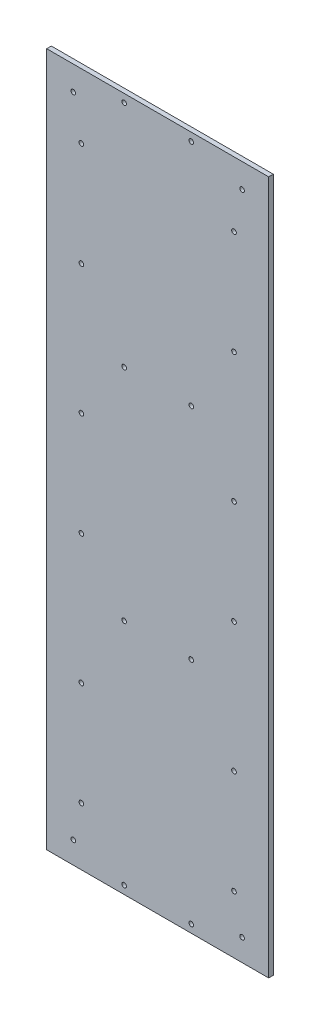
ISO-10303-21;
HEADER;
FILE_DESCRIPTION(('STEP AP214'),'2;1');
FILE_NAME('part.step','',(''),(''),'','','');
FILE_SCHEMA(('AUTOMOTIVE_DESIGN { 1 0 10303 214 1 1 1 1 }'));
ENDSEC;
DATA;
#1=APPLICATION_CONTEXT('core data for automotive mechanical design processes');
#2=APPLICATION_PROTOCOL_DEFINITION('international standard','automotive_design',2000,#1);
#3=PRODUCT_CONTEXT('',#1,'mechanical');
#4=PRODUCT('Part','Part','',(#3));
#5=PRODUCT_RELATED_PRODUCT_CATEGORY('part','',(#4));
#6=PRODUCT_DEFINITION_FORMATION('','',#4);
#7=PRODUCT_DEFINITION_CONTEXT('part definition',#1,'design');
#8=PRODUCT_DEFINITION('design','',#6,#7);
#9=PRODUCT_DEFINITION_SHAPE('','',#8);
#10=(LENGTH_UNIT() NAMED_UNIT(*) SI_UNIT(.MILLI.,.METRE.));
#11=(NAMED_UNIT(*) PLANE_ANGLE_UNIT() SI_UNIT($,.RADIAN.));
#12=(NAMED_UNIT(*) SI_UNIT($,.STERADIAN.) SOLID_ANGLE_UNIT());
#13=UNCERTAINTY_MEASURE_WITH_UNIT(LENGTH_MEASURE(1.E-05),#10,'distance_accuracy_value','');
#14=(GEOMETRIC_REPRESENTATION_CONTEXT(3) GLOBAL_UNCERTAINTY_ASSIGNED_CONTEXT((#13)) GLOBAL_UNIT_ASSIGNED_CONTEXT((#10,
#11,#12)) REPRESENTATION_CONTEXT('',''));
#15=CARTESIAN_POINT('',(0.,0.,0.));
#16=DIRECTION('',(0.,0.,1.));
#17=DIRECTION('',(1.,0.,0.));
#18=AXIS2_PLACEMENT_3D('',#15,#16,#17);
#19=CARTESIAN_POINT('',(-48.,-150.,2.));
#20=DIRECTION('',(1.,0.,0.));
#21=DIRECTION('',(0.,0.,-1.));
#22=AXIS2_PLACEMENT_3D('',#19,#20,#21);
#23=PLANE('',#22);
#24=DIRECTION('',(0.,-1.,0.));
#25=VECTOR('',#24,1.);
#26=CARTESIAN_POINT('',(-48.,-150.,0.));
#27=LINE('',#26,#25);
#28=CARTESIAN_POINT('',(-48.,150.,0.));
#29=VERTEX_POINT('',#28);
#30=CARTESIAN_POINT('',(-48.,-150.,0.));
#31=VERTEX_POINT('',#30);
#32=EDGE_CURVE('E100',#29,#31,#27,.T.);
#33=ORIENTED_EDGE('',*,*,#32,.T.);
#34=DIRECTION('',(0.,0.,-1.));
#35=VECTOR('',#34,1.);
#36=CARTESIAN_POINT('',(-48.,-150.,2.));
#37=LINE('',#36,#35);
#38=CARTESIAN_POINT('',(-48.,-150.,2.));
#39=VERTEX_POINT('',#38);
#40=EDGE_CURVE('E11',#39,#31,#37,.T.);
#41=ORIENTED_EDGE('',*,*,#40,.F.);
#42=DIRECTION('',(0.,-1.,0.));
#43=VECTOR('',#42,1.);
#44=CARTESIAN_POINT('',(-48.,-150.,2.));
#45=LINE('',#44,#43);
#46=CARTESIAN_POINT('',(-48.,150.,2.));
#47=VERTEX_POINT('',#46);
#48=EDGE_CURVE('E87',#47,#39,#45,.T.);
#49=ORIENTED_EDGE('',*,*,#48,.F.);
#50=DIRECTION('',(0.,0.,-1.));
#51=VECTOR('',#50,1.);
#52=CARTESIAN_POINT('',(-48.,150.,2.));
#53=LINE('',#52,#51);
#54=EDGE_CURVE('E96',#47,#29,#53,.T.);
#55=ORIENTED_EDGE('',*,*,#54,.T.);
#56=EDGE_LOOP('',(#33,#41,#49,#55));
#57=FACE_BOUND('',#56,.T.);
#58=ADVANCED_FACE('F34',(#57),#23,.F.);
#59=CARTESIAN_POINT('',(48.,-150.,2.));
#60=DIRECTION('',(0.,1.,0.));
#61=DIRECTION('',(0.,0.,1.));
#62=AXIS2_PLACEMENT_3D('',#59,#60,#61);
#63=PLANE('',#62);
#64=DIRECTION('',(1.,0.,0.));
#65=VECTOR('',#64,1.);
#66=CARTESIAN_POINT('',(48.,-150.,0.));
#67=LINE('',#66,#65);
#68=CARTESIAN_POINT('',(48.,-150.,0.));
#69=VERTEX_POINT('',#68);
#70=EDGE_CURVE('E91',#31,#69,#67,.T.);
#71=ORIENTED_EDGE('',*,*,#70,.T.);
#72=DIRECTION('',(0.,0.,-1.));
#73=VECTOR('',#72,1.);
#74=CARTESIAN_POINT('',(48.,-150.,2.));
#75=LINE('',#74,#73);
#76=CARTESIAN_POINT('',(48.,-150.,2.));
#77=VERTEX_POINT('',#76);
#78=EDGE_CURVE('E43',#77,#69,#75,.T.);
#79=ORIENTED_EDGE('',*,*,#78,.F.);
#80=DIRECTION('',(1.,0.,0.));
#81=VECTOR('',#80,1.);
#82=CARTESIAN_POINT('',(48.,-150.,2.));
#83=LINE('',#82,#81);
#84=EDGE_CURVE('E82',#39,#77,#83,.T.);
#85=ORIENTED_EDGE('',*,*,#84,.F.);
#86=ORIENTED_EDGE('',*,*,#40,.T.);
#87=EDGE_LOOP('',(#71,#79,#85,#86));
#88=FACE_BOUND('',#87,.T.);
#89=ADVANCED_FACE('F90',(#88),#63,.F.);
#90=CARTESIAN_POINT('',(48.,-150.,2.));
#91=DIRECTION('',(-1.,0.,0.));
#92=DIRECTION('',(0.,0.,1.));
#93=AXIS2_PLACEMENT_3D('',#90,#91,#92);
#94=PLANE('',#93);
#95=DIRECTION('',(0.,1.,0.));
#96=VECTOR('',#95,1.);
#97=CARTESIAN_POINT('',(48.,-150.,0.));
#98=LINE('',#97,#96);
#99=CARTESIAN_POINT('',(48.,150.,0.));
#100=VERTEX_POINT('',#99);
#101=EDGE_CURVE('E69',#69,#100,#98,.T.);
#102=ORIENTED_EDGE('',*,*,#101,.T.);
#103=DIRECTION('',(0.,0.,-1.));
#104=VECTOR('',#103,1.);
#105=CARTESIAN_POINT('',(48.,150.,2.));
#106=LINE('',#105,#104);
#107=CARTESIAN_POINT('',(48.,150.,2.));
#108=VERTEX_POINT('',#107);
#109=EDGE_CURVE('E92',#108,#100,#106,.T.);
#110=ORIENTED_EDGE('',*,*,#109,.F.);
#111=DIRECTION('',(0.,1.,0.));
#112=VECTOR('',#111,1.);
#113=CARTESIAN_POINT('',(48.,-150.,2.));
#114=LINE('',#113,#112);
#115=EDGE_CURVE('E85',#77,#108,#114,.T.);
#116=ORIENTED_EDGE('',*,*,#115,.F.);
#117=ORIENTED_EDGE('',*,*,#78,.T.);
#118=EDGE_LOOP('',(#102,#110,#116,#117));
#119=FACE_BOUND('',#118,.T.);
#120=ADVANCED_FACE('F94',(#119),#94,.F.);
#121=CARTESIAN_POINT('',(48.,150.,2.));
#122=DIRECTION('',(0.,-1.,0.));
#123=DIRECTION('',(1.,0.,0.));
#124=AXIS2_PLACEMENT_3D('',#121,#122,#123);
#125=PLANE('',#124);
#126=DIRECTION('',(-1.,0.,0.));
#127=VECTOR('',#126,1.);
#128=CARTESIAN_POINT('',(48.,150.,0.));
#129=LINE('',#128,#127);
#130=EDGE_CURVE('E75',#100,#29,#129,.T.);
#131=ORIENTED_EDGE('',*,*,#130,.T.);
#132=ORIENTED_EDGE('',*,*,#54,.F.);
#133=DIRECTION('',(-1.,0.,0.));
#134=VECTOR('',#133,1.);
#135=CARTESIAN_POINT('',(48.,150.,2.));
#136=LINE('',#135,#134);
#137=EDGE_CURVE('E52',#108,#47,#136,.T.);
#138=ORIENTED_EDGE('',*,*,#137,.F.);
#139=ORIENTED_EDGE('',*,*,#109,.T.);
#140=EDGE_LOOP('',(#131,#132,#138,#139));
#141=FACE_BOUND('',#140,.T.);
#142=ADVANCED_FACE('F249',(#141),#125,.F.);
#143=CARTESIAN_POINT('',(0.,0.,2.));
#144=DIRECTION('',(0.,0.,1.));
#145=DIRECTION('',(1.,0.,0.));
#146=AXIS2_PLACEMENT_3D('',#143,#144,#145);
#147=PLANE('',#146);
#148=CARTESIAN_POINT('',(36.5,139.5,2.));
#149=DIRECTION('',(0.,0.,1.));
#150=DIRECTION('',(1.,0.,0.));
#151=AXIS2_PLACEMENT_3D('',#148,#149,#150);
#152=CIRCLE('',#151,0.999999999999998);
#153=CARTESIAN_POINT('',(37.5,139.5,2.));
#154=VERTEX_POINT('',#153);
#155=EDGE_CURVE('E530',#154,#154,#152,.T.);
#156=ORIENTED_EDGE('',*,*,#155,.F.);
#157=EDGE_LOOP('',(#156));
#158=FACE_BOUND('',#157,.T.);
#159=CARTESIAN_POINT('',(-36.5,-140.5,2.));
#160=DIRECTION('',(0.,0.,1.));
#161=DIRECTION('',(1.,0.,0.));
#162=AXIS2_PLACEMENT_3D('',#159,#160,#161);
#163=CIRCLE('',#162,0.999999999999998);
#164=CARTESIAN_POINT('',(-35.5,-140.5,2.));
#165=VERTEX_POINT('',#164);
#166=EDGE_CURVE('E531',#165,#165,#163,.T.);
#167=ORIENTED_EDGE('',*,*,#166,.F.);
#168=EDGE_LOOP('',(#167));
#169=FACE_BOUND('',#168,.T.);
#170=CARTESIAN_POINT('',(36.5,-140.5,2.));
#171=DIRECTION('',(0.,0.,1.));
#172=DIRECTION('',(1.,0.,0.));
#173=AXIS2_PLACEMENT_3D('',#170,#171,#172);
#174=CIRCLE('',#173,0.999999999999998);
#175=CARTESIAN_POINT('',(37.5,-140.5,2.));
#176=VERTEX_POINT('',#175);
#177=EDGE_CURVE('E536',#176,#176,#174,.T.);
#178=ORIENTED_EDGE('',*,*,#177,.F.);
#179=EDGE_LOOP('',(#178));
#180=FACE_BOUND('',#179,.T.);
#181=CARTESIAN_POINT('',(-36.5,139.5,2.));
#182=DIRECTION('',(0.,0.,1.));
#183=DIRECTION('',(1.,0.,0.));
#184=AXIS2_PLACEMENT_3D('',#181,#182,#183);
#185=CIRCLE('',#184,0.999999999999998);
#186=CARTESIAN_POINT('',(-35.5,139.5,2.));
#187=VERTEX_POINT('',#186);
#188=EDGE_CURVE('E173',#187,#187,#185,.T.);
#189=ORIENTED_EDGE('',*,*,#188,.F.);
#190=EDGE_LOOP('',(#189));
#191=FACE_BOUND('',#190,.T.);
#192=CARTESIAN_POINT('',(14.5,-146.5,2.));
#193=DIRECTION('',(0.,0.,1.));
#194=DIRECTION('',(1.,0.,0.));
#195=AXIS2_PLACEMENT_3D('',#192,#193,#194);
#196=CIRCLE('',#195,1.);
#197=CARTESIAN_POINT('',(15.5,-146.5,2.));
#198=VERTEX_POINT('',#197);
#199=EDGE_CURVE('E203',#198,#198,#196,.T.);
#200=ORIENTED_EDGE('',*,*,#199,.F.);
#201=EDGE_LOOP('',(#200));
#202=FACE_BOUND('',#201,.T.);
#203=CARTESIAN_POINT('',(33.,122.,2.));
#204=DIRECTION('',(0.,0.,1.));
#205=DIRECTION('',(-1.,0.,0.));
#206=AXIS2_PLACEMENT_3D('',#203,#204,#205);
#207=CIRCLE('',#206,0.999999999999998);
#208=CARTESIAN_POINT('',(32.,122.,2.));
#209=VERTEX_POINT('',#208);
#210=EDGE_CURVE('E206',#209,#209,#207,.T.);
#211=ORIENTED_EDGE('',*,*,#210,.F.);
#212=EDGE_LOOP('',(#211));
#213=FACE_BOUND('',#212,.T.);
#214=CARTESIAN_POINT('',(33.,77.,2.));
#215=DIRECTION('',(0.,0.,1.));
#216=DIRECTION('',(-1.,0.,0.));
#217=AXIS2_PLACEMENT_3D('',#214,#215,#216);
#218=CIRCLE('',#217,0.999999999999998);
#219=CARTESIAN_POINT('',(32.,77.,2.));
#220=VERTEX_POINT('',#219);
#221=EDGE_CURVE('E209',#220,#220,#218,.T.);
#222=ORIENTED_EDGE('',*,*,#221,.F.);
#223=EDGE_LOOP('',(#222));
#224=FACE_BOUND('',#223,.T.);
#225=CARTESIAN_POINT('',(33.,-125.,2.));
#226=DIRECTION('',(0.,0.,1.));
#227=DIRECTION('',(-1.,0.,0.));
#228=AXIS2_PLACEMENT_3D('',#225,#226,#227);
#229=CIRCLE('',#228,0.999999999999998);
#230=CARTESIAN_POINT('',(32.,-125.,2.));
#231=VERTEX_POINT('',#230);
#232=EDGE_CURVE('E212',#231,#231,#229,.T.);
#233=ORIENTED_EDGE('',*,*,#232,.F.);
#234=EDGE_LOOP('',(#233));
#235=FACE_BOUND('',#234,.T.);
#236=CARTESIAN_POINT('',(-14.5000000000007,47.5,2.));
#237=DIRECTION('',(0.,0.,1.));
#238=DIRECTION('',(-1.,0.,0.));
#239=AXIS2_PLACEMENT_3D('',#236,#237,#238);
#240=CIRCLE('',#239,1.);
#241=CARTESIAN_POINT('',(-15.5000000000007,47.5,2.));
#242=VERTEX_POINT('',#241);
#243=EDGE_CURVE('E197',#242,#242,#240,.T.);
#244=ORIENTED_EDGE('',*,*,#243,.F.);
#245=EDGE_LOOP('',(#244));
#246=FACE_BOUND('',#245,.T.);
#247=CARTESIAN_POINT('',(14.5,-47.5,2.));
#248=DIRECTION('',(0.,0.,1.));
#249=DIRECTION('',(1.,0.,0.));
#250=AXIS2_PLACEMENT_3D('',#247,#248,#249);
#251=CIRCLE('',#250,1.);
#252=CARTESIAN_POINT('',(15.5,-47.5,2.));
#253=VERTEX_POINT('',#252);
#254=EDGE_CURVE('E193',#253,#253,#251,.T.);
#255=ORIENTED_EDGE('',*,*,#254,.F.);
#256=EDGE_LOOP('',(#255));
#257=FACE_BOUND('',#256,.T.);
#258=CARTESIAN_POINT('',(-14.5,-47.5,2.));
#259=DIRECTION('',(0.,0.,1.));
#260=DIRECTION('',(-1.,0.,0.));
#261=AXIS2_PLACEMENT_3D('',#258,#259,#260);
#262=CIRCLE('',#261,1.);
#263=CARTESIAN_POINT('',(-15.5,-47.5,2.));
#264=VERTEX_POINT('',#263);
#265=EDGE_CURVE('E196',#264,#264,#262,.T.);
#266=ORIENTED_EDGE('',*,*,#265,.F.);
#267=EDGE_LOOP('',(#266));
#268=FACE_BOUND('',#267,.T.);
#269=CARTESIAN_POINT('',(-14.5,-146.5,2.));
#270=DIRECTION('',(0.,0.,1.));
#271=DIRECTION('',(-1.,0.,0.));
#272=AXIS2_PLACEMENT_3D('',#269,#270,#271);
#273=CIRCLE('',#272,1.);
#274=CARTESIAN_POINT('',(-15.5,-146.5,2.));
#275=VERTEX_POINT('',#274);
#276=EDGE_CURVE('E200',#275,#275,#273,.T.);
#277=ORIENTED_EDGE('',*,*,#276,.F.);
#278=EDGE_LOOP('',(#277));
#279=FACE_BOUND('',#278,.T.);
#280=CARTESIAN_POINT('',(-33.,21.,2.));
#281=DIRECTION('',(0.,0.,1.));
#282=DIRECTION('',(1.,0.,0.));
#283=AXIS2_PLACEMENT_3D('',#280,#281,#282);
#284=CIRCLE('',#283,0.999999999999998);
#285=CARTESIAN_POINT('',(-32.,21.,2.));
#286=VERTEX_POINT('',#285);
#287=EDGE_CURVE('E221',#286,#286,#284,.T.);
#288=ORIENTED_EDGE('',*,*,#287,.F.);
#289=EDGE_LOOP('',(#288));
#290=FACE_BOUND('',#289,.T.);
#291=CARTESIAN_POINT('',(-33.,-24.,2.));
#292=DIRECTION('',(0.,0.,1.));
#293=DIRECTION('',(1.,0.,0.));
#294=AXIS2_PLACEMENT_3D('',#291,#292,#293);
#295=CIRCLE('',#294,0.999999999999998);
#296=CARTESIAN_POINT('',(-32.,-24.,2.));
#297=VERTEX_POINT('',#296);
#298=EDGE_CURVE('E230',#297,#297,#295,.T.);
#299=ORIENTED_EDGE('',*,*,#298,.F.);
#300=EDGE_LOOP('',(#299));
#301=FACE_BOUND('',#300,.T.);
#302=CARTESIAN_POINT('',(-33.,-80.,2.));
#303=DIRECTION('',(0.,0.,1.));
#304=DIRECTION('',(1.,0.,0.));
#305=AXIS2_PLACEMENT_3D('',#302,#303,#304);
#306=CIRCLE('',#305,0.999999999999998);
#307=CARTESIAN_POINT('',(-32.,-80.,2.));
#308=VERTEX_POINT('',#307);
#309=EDGE_CURVE('E233',#308,#308,#306,.T.);
#310=ORIENTED_EDGE('',*,*,#309,.F.);
#311=EDGE_LOOP('',(#310));
#312=FACE_BOUND('',#311,.T.);
#313=CARTESIAN_POINT('',(-33.,77.,2.));
#314=DIRECTION('',(0.,0.,1.));
#315=DIRECTION('',(1.,0.,0.));
#316=AXIS2_PLACEMENT_3D('',#313,#314,#315);
#317=CIRCLE('',#316,0.999999999999998);
#318=CARTESIAN_POINT('',(-32.,77.,2.));
#319=VERTEX_POINT('',#318);
#320=EDGE_CURVE('E236',#319,#319,#317,.T.);
#321=ORIENTED_EDGE('',*,*,#320,.F.);
#322=EDGE_LOOP('',(#321));
#323=FACE_BOUND('',#322,.T.);
#324=CARTESIAN_POINT('',(33.,21.,2.));
#325=DIRECTION('',(0.,0.,1.));
#326=DIRECTION('',(-1.,0.,0.));
#327=AXIS2_PLACEMENT_3D('',#324,#325,#326);
#328=CIRCLE('',#327,0.999999999999998);
#329=CARTESIAN_POINT('',(32.,21.,2.));
#330=VERTEX_POINT('',#329);
#331=EDGE_CURVE('E218',#330,#330,#328,.T.);
#332=ORIENTED_EDGE('',*,*,#331,.F.);
#333=EDGE_LOOP('',(#332));
#334=FACE_BOUND('',#333,.T.);
#335=CARTESIAN_POINT('',(33.,-24.,2.));
#336=DIRECTION('',(0.,0.,1.));
#337=DIRECTION('',(-1.,0.,0.));
#338=AXIS2_PLACEMENT_3D('',#335,#336,#337);
#339=CIRCLE('',#338,0.999999999999998);
#340=CARTESIAN_POINT('',(32.,-24.,2.));
#341=VERTEX_POINT('',#340);
#342=EDGE_CURVE('E222',#341,#341,#339,.T.);
#343=ORIENTED_EDGE('',*,*,#342,.F.);
#344=EDGE_LOOP('',(#343));
#345=FACE_BOUND('',#344,.T.);
#346=CARTESIAN_POINT('',(33.,-80.,2.));
#347=DIRECTION('',(0.,0.,1.));
#348=DIRECTION('',(-1.,0.,0.));
#349=AXIS2_PLACEMENT_3D('',#346,#347,#348);
#350=CIRCLE('',#349,0.999999999999998);
#351=CARTESIAN_POINT('',(32.,-80.,2.));
#352=VERTEX_POINT('',#351);
#353=EDGE_CURVE('E225',#352,#352,#350,.T.);
#354=ORIENTED_EDGE('',*,*,#353,.F.);
#355=EDGE_LOOP('',(#354));
#356=FACE_BOUND('',#355,.T.);
#357=CARTESIAN_POINT('',(-33.,-125.,2.));
#358=DIRECTION('',(0.,0.,1.));
#359=DIRECTION('',(1.,0.,0.));
#360=AXIS2_PLACEMENT_3D('',#357,#358,#359);
#361=CIRCLE('',#360,0.999999999999998);
#362=CARTESIAN_POINT('',(-32.,-125.,2.));
#363=VERTEX_POINT('',#362);
#364=EDGE_CURVE('E215',#363,#363,#361,.T.);
#365=ORIENTED_EDGE('',*,*,#364,.F.);
#366=EDGE_LOOP('',(#365));
#367=FACE_BOUND('',#366,.T.);
#368=CARTESIAN_POINT('',(14.499999999999,146.5,2.));
#369=DIRECTION('',(0.,0.,1.));
#370=DIRECTION('',(1.,0.,0.));
#371=AXIS2_PLACEMENT_3D('',#368,#369,#370);
#372=CIRCLE('',#371,1.);
#373=CARTESIAN_POINT('',(15.499999999999,146.5,2.));
#374=VERTEX_POINT('',#373);
#375=EDGE_CURVE('E189',#374,#374,#372,.T.);
#376=ORIENTED_EDGE('',*,*,#375,.F.);
#377=EDGE_LOOP('',(#376));
#378=FACE_BOUND('',#377,.T.);
#379=CARTESIAN_POINT('',(-14.500000000001,146.5,2.));
#380=DIRECTION('',(0.,0.,1.));
#381=DIRECTION('',(-1.,0.,0.));
#382=AXIS2_PLACEMENT_3D('',#379,#380,#381);
#383=CIRCLE('',#382,1.);
#384=CARTESIAN_POINT('',(-15.500000000001,146.5,2.));
#385=VERTEX_POINT('',#384);
#386=EDGE_CURVE('E184',#385,#385,#383,.T.);
#387=ORIENTED_EDGE('',*,*,#386,.F.);
#388=EDGE_LOOP('',(#387));
#389=FACE_BOUND('',#388,.T.);
#390=CARTESIAN_POINT('',(14.5000000000007,47.5,2.));
#391=DIRECTION('',(0.,0.,1.));
#392=DIRECTION('',(1.,0.,0.));
#393=AXIS2_PLACEMENT_3D('',#390,#391,#392);
#394=CIRCLE('',#393,1.);
#395=CARTESIAN_POINT('',(15.5000000000007,47.5,2.));
#396=VERTEX_POINT('',#395);
#397=EDGE_CURVE('E180',#396,#396,#394,.T.);
#398=ORIENTED_EDGE('',*,*,#397,.F.);
#399=EDGE_LOOP('',(#398));
#400=FACE_BOUND('',#399,.T.);
#401=CARTESIAN_POINT('',(-33.,122.,2.));
#402=DIRECTION('',(0.,0.,1.));
#403=DIRECTION('',(1.,0.,0.));
#404=AXIS2_PLACEMENT_3D('',#401,#402,#403);
#405=CIRCLE('',#404,0.999999999999998);
#406=CARTESIAN_POINT('',(-32.,122.,2.));
#407=VERTEX_POINT('',#406);
#408=EDGE_CURVE('E113',#407,#407,#405,.T.);
#409=ORIENTED_EDGE('',*,*,#408,.F.);
#410=EDGE_LOOP('',(#409));
#411=FACE_BOUND('',#410,.T.);
#412=ORIENTED_EDGE('',*,*,#48,.T.);
#413=ORIENTED_EDGE('',*,*,#84,.T.);
#414=ORIENTED_EDGE('',*,*,#115,.T.);
#415=ORIENTED_EDGE('',*,*,#137,.T.);
#416=EDGE_LOOP('',(#412,#413,#414,#415));
#417=FACE_BOUND('',#416,.T.);
#418=ADVANCED_FACE('F83',(#158,#169,#180,#191,#202,#213,#224,#235,#246,#257,#268,#279,#290,#301,
#312,#323,#334,#345,#356,#367,#378,#389,#400,#411,#417),#147,.T.);
#419=CARTESIAN_POINT('',(0.,0.,0.));
#420=DIRECTION('',(0.,0.,1.));
#421=DIRECTION('',(1.,0.,0.));
#422=AXIS2_PLACEMENT_3D('',#419,#420,#421);
#423=PLANE('',#422);
#424=CARTESIAN_POINT('',(36.5,139.5,0.));
#425=DIRECTION('',(0.,0.,1.));
#426=DIRECTION('',(1.,0.,0.));
#427=AXIS2_PLACEMENT_3D('',#424,#425,#426);
#428=CIRCLE('',#427,0.999999999999998);
#429=CARTESIAN_POINT('',(37.5,139.5,0.));
#430=VERTEX_POINT('',#429);
#431=EDGE_CURVE('E37',#430,#430,#428,.T.);
#432=ORIENTED_EDGE('',*,*,#431,.T.);
#433=EDGE_LOOP('',(#432));
#434=FACE_BOUND('',#433,.T.);
#435=CARTESIAN_POINT('',(-36.5,-140.5,0.));
#436=DIRECTION('',(0.,0.,1.));
#437=DIRECTION('',(1.,0.,0.));
#438=AXIS2_PLACEMENT_3D('',#435,#436,#437);
#439=CIRCLE('',#438,0.999999999999998);
#440=CARTESIAN_POINT('',(-35.5,-140.5,0.));
#441=VERTEX_POINT('',#440);
#442=EDGE_CURVE('E175',#441,#441,#439,.T.);
#443=ORIENTED_EDGE('',*,*,#442,.T.);
#444=EDGE_LOOP('',(#443));
#445=FACE_BOUND('',#444,.T.);
#446=CARTESIAN_POINT('',(36.5,-140.5,0.));
#447=DIRECTION('',(0.,0.,1.));
#448=DIRECTION('',(1.,0.,0.));
#449=AXIS2_PLACEMENT_3D('',#446,#447,#448);
#450=CIRCLE('',#449,0.999999999999998);
#451=CARTESIAN_POINT('',(37.5,-140.5,0.));
#452=VERTEX_POINT('',#451);
#453=EDGE_CURVE('E172',#452,#452,#450,.T.);
#454=ORIENTED_EDGE('',*,*,#453,.T.);
#455=EDGE_LOOP('',(#454));
#456=FACE_BOUND('',#455,.T.);
#457=CARTESIAN_POINT('',(-36.5,139.5,0.));
#458=DIRECTION('',(0.,0.,1.));
#459=DIRECTION('',(1.,0.,0.));
#460=AXIS2_PLACEMENT_3D('',#457,#458,#459);
#461=CIRCLE('',#460,0.999999999999998);
#462=CARTESIAN_POINT('',(-35.5,139.5,0.));
#463=VERTEX_POINT('',#462);
#464=EDGE_CURVE('E169',#463,#463,#461,.T.);
#465=ORIENTED_EDGE('',*,*,#464,.T.);
#466=EDGE_LOOP('',(#465));
#467=FACE_BOUND('',#466,.T.);
#468=CARTESIAN_POINT('',(14.5,-146.5,0.));
#469=DIRECTION('',(0.,0.,1.));
#470=DIRECTION('',(1.,0.,0.));
#471=AXIS2_PLACEMENT_3D('',#468,#469,#470);
#472=CIRCLE('',#471,1.);
#473=CARTESIAN_POINT('',(15.5,-146.5,0.));
#474=VERTEX_POINT('',#473);
#475=EDGE_CURVE('E103',#474,#474,#472,.T.);
#476=ORIENTED_EDGE('',*,*,#475,.T.);
#477=EDGE_LOOP('',(#476));
#478=FACE_BOUND('',#477,.T.);
#479=CARTESIAN_POINT('',(33.,122.,0.));
#480=DIRECTION('',(0.,0.,1.));
#481=DIRECTION('',(1.,0.,0.));
#482=AXIS2_PLACEMENT_3D('',#479,#480,#481);
#483=CIRCLE('',#482,0.999999999999998);
#484=CARTESIAN_POINT('',(34.,122.,0.));
#485=VERTEX_POINT('',#484);
#486=EDGE_CURVE('E164',#485,#485,#483,.T.);
#487=ORIENTED_EDGE('',*,*,#486,.T.);
#488=EDGE_LOOP('',(#487));
#489=FACE_BOUND('',#488,.T.);
#490=CARTESIAN_POINT('',(33.,77.,0.));
#491=DIRECTION('',(0.,0.,1.));
#492=DIRECTION('',(1.,0.,0.));
#493=AXIS2_PLACEMENT_3D('',#490,#491,#492);
#494=CIRCLE('',#493,0.999999999999998);
#495=CARTESIAN_POINT('',(34.,77.,0.));
#496=VERTEX_POINT('',#495);
#497=EDGE_CURVE('E161',#496,#496,#494,.T.);
#498=ORIENTED_EDGE('',*,*,#497,.T.);
#499=EDGE_LOOP('',(#498));
#500=FACE_BOUND('',#499,.T.);
#501=CARTESIAN_POINT('',(33.,-125.,0.));
#502=DIRECTION('',(0.,0.,1.));
#503=DIRECTION('',(1.,0.,0.));
#504=AXIS2_PLACEMENT_3D('',#501,#502,#503);
#505=CIRCLE('',#504,0.999999999999998);
#506=CARTESIAN_POINT('',(34.,-125.,0.));
#507=VERTEX_POINT('',#506);
#508=EDGE_CURVE('E158',#507,#507,#505,.T.);
#509=ORIENTED_EDGE('',*,*,#508,.T.);
#510=EDGE_LOOP('',(#509));
#511=FACE_BOUND('',#510,.T.);
#512=CARTESIAN_POINT('',(-14.5000000000007,47.5,0.));
#513=DIRECTION('',(0.,0.,1.));
#514=DIRECTION('',(1.,0.,0.));
#515=AXIS2_PLACEMENT_3D('',#512,#513,#514);
#516=CIRCLE('',#515,1.);
#517=CARTESIAN_POINT('',(-13.5000000000007,47.5,0.));
#518=VERTEX_POINT('',#517);
#519=EDGE_CURVE('E155',#518,#518,#516,.T.);
#520=ORIENTED_EDGE('',*,*,#519,.T.);
#521=EDGE_LOOP('',(#520));
#522=FACE_BOUND('',#521,.T.);
#523=CARTESIAN_POINT('',(14.5,-47.5,0.));
#524=DIRECTION('',(0.,0.,1.));
#525=DIRECTION('',(1.,0.,0.));
#526=AXIS2_PLACEMENT_3D('',#523,#524,#525);
#527=CIRCLE('',#526,1.);
#528=CARTESIAN_POINT('',(15.5,-47.5,0.));
#529=VERTEX_POINT('',#528);
#530=EDGE_CURVE('E152',#529,#529,#527,.T.);
#531=ORIENTED_EDGE('',*,*,#530,.T.);
#532=EDGE_LOOP('',(#531));
#533=FACE_BOUND('',#532,.T.);
#534=CARTESIAN_POINT('',(-14.5,-47.5,0.));
#535=DIRECTION('',(0.,0.,1.));
#536=DIRECTION('',(1.,0.,0.));
#537=AXIS2_PLACEMENT_3D('',#534,#535,#536);
#538=CIRCLE('',#537,1.);
#539=CARTESIAN_POINT('',(-13.5,-47.5,0.));
#540=VERTEX_POINT('',#539);
#541=EDGE_CURVE('E149',#540,#540,#538,.T.);
#542=ORIENTED_EDGE('',*,*,#541,.T.);
#543=EDGE_LOOP('',(#542));
#544=FACE_BOUND('',#543,.T.);
#545=CARTESIAN_POINT('',(-14.5,-146.5,0.));
#546=DIRECTION('',(0.,0.,1.));
#547=DIRECTION('',(1.,0.,0.));
#548=AXIS2_PLACEMENT_3D('',#545,#546,#547);
#549=CIRCLE('',#548,1.);
#550=CARTESIAN_POINT('',(-13.5,-146.5,0.));
#551=VERTEX_POINT('',#550);
#552=EDGE_CURVE('E146',#551,#551,#549,.T.);
#553=ORIENTED_EDGE('',*,*,#552,.T.);
#554=EDGE_LOOP('',(#553));
#555=FACE_BOUND('',#554,.T.);
#556=CARTESIAN_POINT('',(-33.,21.,0.));
#557=DIRECTION('',(0.,0.,1.));
#558=DIRECTION('',(1.,0.,0.));
#559=AXIS2_PLACEMENT_3D('',#556,#557,#558);
#560=CIRCLE('',#559,0.999999999999998);
#561=CARTESIAN_POINT('',(-32.,21.,0.));
#562=VERTEX_POINT('',#561);
#563=EDGE_CURVE('E143',#562,#562,#560,.T.);
#564=ORIENTED_EDGE('',*,*,#563,.T.);
#565=EDGE_LOOP('',(#564));
#566=FACE_BOUND('',#565,.T.);
#567=CARTESIAN_POINT('',(-33.,-24.,0.));
#568=DIRECTION('',(0.,0.,1.));
#569=DIRECTION('',(1.,0.,0.));
#570=AXIS2_PLACEMENT_3D('',#567,#568,#569);
#571=CIRCLE('',#570,0.999999999999998);
#572=CARTESIAN_POINT('',(-32.,-24.,0.));
#573=VERTEX_POINT('',#572);
#574=EDGE_CURVE('E140',#573,#573,#571,.T.);
#575=ORIENTED_EDGE('',*,*,#574,.T.);
#576=EDGE_LOOP('',(#575));
#577=FACE_BOUND('',#576,.T.);
#578=CARTESIAN_POINT('',(-33.,-80.,0.));
#579=DIRECTION('',(0.,0.,1.));
#580=DIRECTION('',(1.,0.,0.));
#581=AXIS2_PLACEMENT_3D('',#578,#579,#580);
#582=CIRCLE('',#581,0.999999999999998);
#583=CARTESIAN_POINT('',(-32.,-80.,0.));
#584=VERTEX_POINT('',#583);
#585=EDGE_CURVE('E137',#584,#584,#582,.T.);
#586=ORIENTED_EDGE('',*,*,#585,.T.);
#587=EDGE_LOOP('',(#586));
#588=FACE_BOUND('',#587,.T.);
#589=CARTESIAN_POINT('',(-33.,77.,0.));
#590=DIRECTION('',(0.,0.,1.));
#591=DIRECTION('',(1.,0.,0.));
#592=AXIS2_PLACEMENT_3D('',#589,#590,#591);
#593=CIRCLE('',#592,0.999999999999998);
#594=CARTESIAN_POINT('',(-32.,77.,0.));
#595=VERTEX_POINT('',#594);
#596=EDGE_CURVE('E134',#595,#595,#593,.T.);
#597=ORIENTED_EDGE('',*,*,#596,.T.);
#598=EDGE_LOOP('',(#597));
#599=FACE_BOUND('',#598,.T.);
#600=CARTESIAN_POINT('',(33.,21.,0.));
#601=DIRECTION('',(0.,0.,1.));
#602=DIRECTION('',(1.,0.,0.));
#603=AXIS2_PLACEMENT_3D('',#600,#601,#602);
#604=CIRCLE('',#603,0.999999999999998);
#605=CARTESIAN_POINT('',(34.,21.,0.));
#606=VERTEX_POINT('',#605);
#607=EDGE_CURVE('E131',#606,#606,#604,.T.);
#608=ORIENTED_EDGE('',*,*,#607,.T.);
#609=EDGE_LOOP('',(#608));
#610=FACE_BOUND('',#609,.T.);
#611=CARTESIAN_POINT('',(33.,-24.,0.));
#612=DIRECTION('',(0.,0.,1.));
#613=DIRECTION('',(1.,0.,0.));
#614=AXIS2_PLACEMENT_3D('',#611,#612,#613);
#615=CIRCLE('',#614,0.999999999999998);
#616=CARTESIAN_POINT('',(34.,-24.,0.));
#617=VERTEX_POINT('',#616);
#618=EDGE_CURVE('E128',#617,#617,#615,.T.);
#619=ORIENTED_EDGE('',*,*,#618,.T.);
#620=EDGE_LOOP('',(#619));
#621=FACE_BOUND('',#620,.T.);
#622=CARTESIAN_POINT('',(33.,-80.,0.));
#623=DIRECTION('',(0.,0.,1.));
#624=DIRECTION('',(1.,0.,0.));
#625=AXIS2_PLACEMENT_3D('',#622,#623,#624);
#626=CIRCLE('',#625,0.999999999999998);
#627=CARTESIAN_POINT('',(34.,-80.,0.));
#628=VERTEX_POINT('',#627);
#629=EDGE_CURVE('E125',#628,#628,#626,.T.);
#630=ORIENTED_EDGE('',*,*,#629,.T.);
#631=EDGE_LOOP('',(#630));
#632=FACE_BOUND('',#631,.T.);
#633=CARTESIAN_POINT('',(-33.,-125.,0.));
#634=DIRECTION('',(0.,0.,1.));
#635=DIRECTION('',(1.,0.,0.));
#636=AXIS2_PLACEMENT_3D('',#633,#634,#635);
#637=CIRCLE('',#636,0.999999999999998);
#638=CARTESIAN_POINT('',(-32.,-125.,0.));
#639=VERTEX_POINT('',#638);
#640=EDGE_CURVE('E122',#639,#639,#637,.T.);
#641=ORIENTED_EDGE('',*,*,#640,.T.);
#642=EDGE_LOOP('',(#641));
#643=FACE_BOUND('',#642,.T.);
#644=CARTESIAN_POINT('',(14.499999999999,146.5,0.));
#645=DIRECTION('',(0.,0.,1.));
#646=DIRECTION('',(1.,0.,0.));
#647=AXIS2_PLACEMENT_3D('',#644,#645,#646);
#648=CIRCLE('',#647,1.);
#649=CARTESIAN_POINT('',(15.499999999999,146.5,0.));
#650=VERTEX_POINT('',#649);
#651=EDGE_CURVE('E119',#650,#650,#648,.T.);
#652=ORIENTED_EDGE('',*,*,#651,.T.);
#653=EDGE_LOOP('',(#652));
#654=FACE_BOUND('',#653,.T.);
#655=CARTESIAN_POINT('',(-14.500000000001,146.5,0.));
#656=DIRECTION('',(0.,0.,1.));
#657=DIRECTION('',(1.,0.,0.));
#658=AXIS2_PLACEMENT_3D('',#655,#656,#657);
#659=CIRCLE('',#658,1.);
#660=CARTESIAN_POINT('',(-13.500000000001,146.5,0.));
#661=VERTEX_POINT('',#660);
#662=EDGE_CURVE('E116',#661,#661,#659,.T.);
#663=ORIENTED_EDGE('',*,*,#662,.T.);
#664=EDGE_LOOP('',(#663));
#665=FACE_BOUND('',#664,.T.);
#666=CARTESIAN_POINT('',(14.5000000000007,47.5,0.));
#667=DIRECTION('',(0.,0.,1.));
#668=DIRECTION('',(1.,0.,0.));
#669=AXIS2_PLACEMENT_3D('',#666,#667,#668);
#670=CIRCLE('',#669,1.);
#671=CARTESIAN_POINT('',(15.5000000000007,47.5,0.));
#672=VERTEX_POINT('',#671);
#673=EDGE_CURVE('E112',#672,#672,#670,.T.);
#674=ORIENTED_EDGE('',*,*,#673,.T.);
#675=EDGE_LOOP('',(#674));
#676=FACE_BOUND('',#675,.T.);
#677=CARTESIAN_POINT('',(-33.,122.,0.));
#678=DIRECTION('',(0.,0.,1.));
#679=DIRECTION('',(1.,0.,0.));
#680=AXIS2_PLACEMENT_3D('',#677,#678,#679);
#681=CIRCLE('',#680,0.999999999999998);
#682=CARTESIAN_POINT('',(-32.,122.,0.));
#683=VERTEX_POINT('',#682);
#684=EDGE_CURVE('E109',#683,#683,#681,.T.);
#685=ORIENTED_EDGE('',*,*,#684,.T.);
#686=EDGE_LOOP('',(#685));
#687=FACE_BOUND('',#686,.T.);
#688=ORIENTED_EDGE('',*,*,#32,.F.);
#689=ORIENTED_EDGE('',*,*,#130,.F.);
#690=ORIENTED_EDGE('',*,*,#101,.F.);
#691=ORIENTED_EDGE('',*,*,#70,.F.);
#692=EDGE_LOOP('',(#688,#689,#690,#691));
#693=FACE_BOUND('',#692,.T.);
#694=ADVANCED_FACE('F248',(#434,#445,#456,#467,#478,#489,#500,#511,#522,#533,#544,#555,#566,
#577,#588,#599,#610,#621,#632,#643,#654,#665,#676,#687,#693),#423,.F.);
#695=CARTESIAN_POINT('',(-33.,122.,-8.));
#696=DIRECTION('',(0.,0.,1.));
#697=DIRECTION('',(1.,0.,0.));
#698=AXIS2_PLACEMENT_3D('',#695,#696,#697);
#699=CYLINDRICAL_SURFACE('',#698,0.999999999999998);
#700=ORIENTED_EDGE('',*,*,#408,.T.);
#701=EDGE_LOOP('',(#700));
#702=FACE_BOUND('',#701,.T.);
#703=ORIENTED_EDGE('',*,*,#684,.F.);
#704=EDGE_LOOP('',(#703));
#705=FACE_BOUND('',#704,.T.);
#706=ADVANCED_FACE('F244',(#702,#705),#699,.F.);
#707=CARTESIAN_POINT('',(14.5000000000007,47.5,-8.));
#708=DIRECTION('',(0.,0.,1.));
#709=DIRECTION('',(1.,0.,0.));
#710=AXIS2_PLACEMENT_3D('',#707,#708,#709);
#711=CYLINDRICAL_SURFACE('',#710,1.);
#712=ORIENTED_EDGE('',*,*,#397,.T.);
#713=EDGE_LOOP('',(#712));
#714=FACE_BOUND('',#713,.T.);
#715=ORIENTED_EDGE('',*,*,#673,.F.);
#716=EDGE_LOOP('',(#715));
#717=FACE_BOUND('',#716,.T.);
#718=ADVANCED_FACE('F288',(#714,#717),#711,.F.);
#719=CARTESIAN_POINT('',(-14.500000000001,146.5,-8.));
#720=DIRECTION('',(0.,0.,1.));
#721=DIRECTION('',(1.,0.,0.));
#722=AXIS2_PLACEMENT_3D('',#719,#720,#721);
#723=CYLINDRICAL_SURFACE('',#722,1.);
#724=ORIENTED_EDGE('',*,*,#386,.T.);
#725=EDGE_LOOP('',(#724));
#726=FACE_BOUND('',#725,.T.);
#727=ORIENTED_EDGE('',*,*,#662,.F.);
#728=EDGE_LOOP('',(#727));
#729=FACE_BOUND('',#728,.T.);
#730=ADVANCED_FACE('F297',(#726,#729),#723,.F.);
#731=CARTESIAN_POINT('',(14.499999999999,146.5,-8.));
#732=DIRECTION('',(0.,0.,1.));
#733=DIRECTION('',(1.,0.,0.));
#734=AXIS2_PLACEMENT_3D('',#731,#732,#733);
#735=CYLINDRICAL_SURFACE('',#734,1.);
#736=ORIENTED_EDGE('',*,*,#375,.T.);
#737=EDGE_LOOP('',(#736));
#738=FACE_BOUND('',#737,.T.);
#739=ORIENTED_EDGE('',*,*,#651,.F.);
#740=EDGE_LOOP('',(#739));
#741=FACE_BOUND('',#740,.T.);
#742=ADVANCED_FACE('F306',(#738,#741),#735,.F.);
#743=CARTESIAN_POINT('',(-33.,-125.,-8.));
#744=DIRECTION('',(0.,0.,1.));
#745=DIRECTION('',(1.,0.,0.));
#746=AXIS2_PLACEMENT_3D('',#743,#744,#745);
#747=CYLINDRICAL_SURFACE('',#746,0.999999999999998);
#748=ORIENTED_EDGE('',*,*,#364,.T.);
#749=EDGE_LOOP('',(#748));
#750=FACE_BOUND('',#749,.T.);
#751=ORIENTED_EDGE('',*,*,#640,.F.);
#752=EDGE_LOOP('',(#751));
#753=FACE_BOUND('',#752,.T.);
#754=ADVANCED_FACE('F316',(#750,#753),#747,.F.);
#755=CARTESIAN_POINT('',(33.,-80.,-8.));
#756=DIRECTION('',(0.,0.,1.));
#757=DIRECTION('',(1.,0.,0.));
#758=AXIS2_PLACEMENT_3D('',#755,#756,#757);
#759=CYLINDRICAL_SURFACE('',#758,0.999999999999998);
#760=ORIENTED_EDGE('',*,*,#353,.T.);
#761=EDGE_LOOP('',(#760));
#762=FACE_BOUND('',#761,.T.);
#763=ORIENTED_EDGE('',*,*,#629,.F.);
#764=EDGE_LOOP('',(#763));
#765=FACE_BOUND('',#764,.T.);
#766=ADVANCED_FACE('F326',(#762,#765),#759,.F.);
#767=CARTESIAN_POINT('',(33.,-24.,-8.));
#768=DIRECTION('',(0.,0.,1.));
#769=DIRECTION('',(1.,0.,0.));
#770=AXIS2_PLACEMENT_3D('',#767,#768,#769);
#771=CYLINDRICAL_SURFACE('',#770,0.999999999999998);
#772=ORIENTED_EDGE('',*,*,#342,.T.);
#773=EDGE_LOOP('',(#772));
#774=FACE_BOUND('',#773,.T.);
#775=ORIENTED_EDGE('',*,*,#618,.F.);
#776=EDGE_LOOP('',(#775));
#777=FACE_BOUND('',#776,.T.);
#778=ADVANCED_FACE('F336',(#774,#777),#771,.F.);
#779=CARTESIAN_POINT('',(33.,21.,-8.));
#780=DIRECTION('',(0.,0.,1.));
#781=DIRECTION('',(1.,0.,0.));
#782=AXIS2_PLACEMENT_3D('',#779,#780,#781);
#783=CYLINDRICAL_SURFACE('',#782,0.999999999999998);
#784=ORIENTED_EDGE('',*,*,#331,.T.);
#785=EDGE_LOOP('',(#784));
#786=FACE_BOUND('',#785,.T.);
#787=ORIENTED_EDGE('',*,*,#607,.F.);
#788=EDGE_LOOP('',(#787));
#789=FACE_BOUND('',#788,.T.);
#790=ADVANCED_FACE('F346',(#786,#789),#783,.F.);
#791=CARTESIAN_POINT('',(-33.,77.,-8.));
#792=DIRECTION('',(0.,0.,1.));
#793=DIRECTION('',(1.,0.,0.));
#794=AXIS2_PLACEMENT_3D('',#791,#792,#793);
#795=CYLINDRICAL_SURFACE('',#794,0.999999999999998);
#796=ORIENTED_EDGE('',*,*,#320,.T.);
#797=EDGE_LOOP('',(#796));
#798=FACE_BOUND('',#797,.T.);
#799=ORIENTED_EDGE('',*,*,#596,.F.);
#800=EDGE_LOOP('',(#799));
#801=FACE_BOUND('',#800,.T.);
#802=ADVANCED_FACE('F356',(#798,#801),#795,.F.);
#803=CARTESIAN_POINT('',(-33.,-80.,-8.));
#804=DIRECTION('',(0.,0.,1.));
#805=DIRECTION('',(1.,0.,0.));
#806=AXIS2_PLACEMENT_3D('',#803,#804,#805);
#807=CYLINDRICAL_SURFACE('',#806,0.999999999999998);
#808=ORIENTED_EDGE('',*,*,#309,.T.);
#809=EDGE_LOOP('',(#808));
#810=FACE_BOUND('',#809,.T.);
#811=ORIENTED_EDGE('',*,*,#585,.F.);
#812=EDGE_LOOP('',(#811));
#813=FACE_BOUND('',#812,.T.);
#814=ADVANCED_FACE('F366',(#810,#813),#807,.F.);
#815=CARTESIAN_POINT('',(-33.,-24.,-8.));
#816=DIRECTION('',(0.,0.,1.));
#817=DIRECTION('',(1.,0.,0.));
#818=AXIS2_PLACEMENT_3D('',#815,#816,#817);
#819=CYLINDRICAL_SURFACE('',#818,0.999999999999998);
#820=ORIENTED_EDGE('',*,*,#298,.T.);
#821=EDGE_LOOP('',(#820));
#822=FACE_BOUND('',#821,.T.);
#823=ORIENTED_EDGE('',*,*,#574,.F.);
#824=EDGE_LOOP('',(#823));
#825=FACE_BOUND('',#824,.T.);
#826=ADVANCED_FACE('F376',(#822,#825),#819,.F.);
#827=CARTESIAN_POINT('',(-33.,21.,-8.));
#828=DIRECTION('',(0.,0.,1.));
#829=DIRECTION('',(1.,0.,0.));
#830=AXIS2_PLACEMENT_3D('',#827,#828,#829);
#831=CYLINDRICAL_SURFACE('',#830,0.999999999999998);
#832=ORIENTED_EDGE('',*,*,#287,.T.);
#833=EDGE_LOOP('',(#832));
#834=FACE_BOUND('',#833,.T.);
#835=ORIENTED_EDGE('',*,*,#563,.F.);
#836=EDGE_LOOP('',(#835));
#837=FACE_BOUND('',#836,.T.);
#838=ADVANCED_FACE('F386',(#834,#837),#831,.F.);
#839=CARTESIAN_POINT('',(-14.5,-146.5,-8.));
#840=DIRECTION('',(0.,0.,1.));
#841=DIRECTION('',(1.,0.,0.));
#842=AXIS2_PLACEMENT_3D('',#839,#840,#841);
#843=CYLINDRICAL_SURFACE('',#842,1.);
#844=ORIENTED_EDGE('',*,*,#276,.T.);
#845=EDGE_LOOP('',(#844));
#846=FACE_BOUND('',#845,.T.);
#847=ORIENTED_EDGE('',*,*,#552,.F.);
#848=EDGE_LOOP('',(#847));
#849=FACE_BOUND('',#848,.T.);
#850=ADVANCED_FACE('F396',(#846,#849),#843,.F.);
#851=CARTESIAN_POINT('',(-14.5,-47.5,-8.));
#852=DIRECTION('',(0.,0.,1.));
#853=DIRECTION('',(1.,0.,0.));
#854=AXIS2_PLACEMENT_3D('',#851,#852,#853);
#855=CYLINDRICAL_SURFACE('',#854,1.);
#856=ORIENTED_EDGE('',*,*,#265,.T.);
#857=EDGE_LOOP('',(#856));
#858=FACE_BOUND('',#857,.T.);
#859=ORIENTED_EDGE('',*,*,#541,.F.);
#860=EDGE_LOOP('',(#859));
#861=FACE_BOUND('',#860,.T.);
#862=ADVANCED_FACE('F406',(#858,#861),#855,.F.);
#863=CARTESIAN_POINT('',(14.5,-47.5,-8.));
#864=DIRECTION('',(0.,0.,1.));
#865=DIRECTION('',(1.,0.,0.));
#866=AXIS2_PLACEMENT_3D('',#863,#864,#865);
#867=CYLINDRICAL_SURFACE('',#866,1.);
#868=ORIENTED_EDGE('',*,*,#254,.T.);
#869=EDGE_LOOP('',(#868));
#870=FACE_BOUND('',#869,.T.);
#871=ORIENTED_EDGE('',*,*,#530,.F.);
#872=EDGE_LOOP('',(#871));
#873=FACE_BOUND('',#872,.T.);
#874=ADVANCED_FACE('F416',(#870,#873),#867,.F.);
#875=CARTESIAN_POINT('',(-14.5000000000007,47.5,-8.));
#876=DIRECTION('',(0.,0.,1.));
#877=DIRECTION('',(1.,0.,0.));
#878=AXIS2_PLACEMENT_3D('',#875,#876,#877);
#879=CYLINDRICAL_SURFACE('',#878,1.);
#880=ORIENTED_EDGE('',*,*,#243,.T.);
#881=EDGE_LOOP('',(#880));
#882=FACE_BOUND('',#881,.T.);
#883=ORIENTED_EDGE('',*,*,#519,.F.);
#884=EDGE_LOOP('',(#883));
#885=FACE_BOUND('',#884,.T.);
#886=ADVANCED_FACE('F426',(#882,#885),#879,.F.);
#887=CARTESIAN_POINT('',(33.,-125.,-8.));
#888=DIRECTION('',(0.,0.,1.));
#889=DIRECTION('',(1.,0.,0.));
#890=AXIS2_PLACEMENT_3D('',#887,#888,#889);
#891=CYLINDRICAL_SURFACE('',#890,0.999999999999998);
#892=ORIENTED_EDGE('',*,*,#232,.T.);
#893=EDGE_LOOP('',(#892));
#894=FACE_BOUND('',#893,.T.);
#895=ORIENTED_EDGE('',*,*,#508,.F.);
#896=EDGE_LOOP('',(#895));
#897=FACE_BOUND('',#896,.T.);
#898=ADVANCED_FACE('F436',(#894,#897),#891,.F.);
#899=CARTESIAN_POINT('',(33.,77.,-8.));
#900=DIRECTION('',(0.,0.,1.));
#901=DIRECTION('',(1.,0.,0.));
#902=AXIS2_PLACEMENT_3D('',#899,#900,#901);
#903=CYLINDRICAL_SURFACE('',#902,0.999999999999998);
#904=ORIENTED_EDGE('',*,*,#221,.T.);
#905=EDGE_LOOP('',(#904));
#906=FACE_BOUND('',#905,.T.);
#907=ORIENTED_EDGE('',*,*,#497,.F.);
#908=EDGE_LOOP('',(#907));
#909=FACE_BOUND('',#908,.T.);
#910=ADVANCED_FACE('F446',(#906,#909),#903,.F.);
#911=CARTESIAN_POINT('',(33.,122.,-8.));
#912=DIRECTION('',(0.,0.,1.));
#913=DIRECTION('',(1.,0.,0.));
#914=AXIS2_PLACEMENT_3D('',#911,#912,#913);
#915=CYLINDRICAL_SURFACE('',#914,0.999999999999998);
#916=ORIENTED_EDGE('',*,*,#210,.T.);
#917=EDGE_LOOP('',(#916));
#918=FACE_BOUND('',#917,.T.);
#919=ORIENTED_EDGE('',*,*,#486,.F.);
#920=EDGE_LOOP('',(#919));
#921=FACE_BOUND('',#920,.T.);
#922=ADVANCED_FACE('F456',(#918,#921),#915,.F.);
#923=CARTESIAN_POINT('',(14.5,-146.5,-8.));
#924=DIRECTION('',(0.,0.,1.));
#925=DIRECTION('',(1.,0.,0.));
#926=AXIS2_PLACEMENT_3D('',#923,#924,#925);
#927=CYLINDRICAL_SURFACE('',#926,1.);
#928=ORIENTED_EDGE('',*,*,#199,.T.);
#929=EDGE_LOOP('',(#928));
#930=FACE_BOUND('',#929,.T.);
#931=ORIENTED_EDGE('',*,*,#475,.F.);
#932=EDGE_LOOP('',(#931));
#933=FACE_BOUND('',#932,.T.);
#934=ADVANCED_FACE('F466',(#930,#933),#927,.F.);
#935=CARTESIAN_POINT('',(-36.5,139.5,-8.));
#936=DIRECTION('',(0.,0.,1.));
#937=DIRECTION('',(1.,0.,0.));
#938=AXIS2_PLACEMENT_3D('',#935,#936,#937);
#939=CYLINDRICAL_SURFACE('',#938,0.999999999999998);
#940=ORIENTED_EDGE('',*,*,#188,.T.);
#941=EDGE_LOOP('',(#940));
#942=FACE_BOUND('',#941,.T.);
#943=ORIENTED_EDGE('',*,*,#464,.F.);
#944=EDGE_LOOP('',(#943));
#945=FACE_BOUND('',#944,.T.);
#946=ADVANCED_FACE('F475',(#942,#945),#939,.F.);
#947=CARTESIAN_POINT('',(36.5,-140.5,-8.));
#948=DIRECTION('',(0.,0.,1.));
#949=DIRECTION('',(1.,0.,0.));
#950=AXIS2_PLACEMENT_3D('',#947,#948,#949);
#951=CYLINDRICAL_SURFACE('',#950,0.999999999999998);
#952=ORIENTED_EDGE('',*,*,#177,.T.);
#953=EDGE_LOOP('',(#952));
#954=FACE_BOUND('',#953,.T.);
#955=ORIENTED_EDGE('',*,*,#453,.F.);
#956=EDGE_LOOP('',(#955));
#957=FACE_BOUND('',#956,.T.);
#958=ADVANCED_FACE('F494',(#954,#957),#951,.F.);
#959=CARTESIAN_POINT('',(-36.5,-140.5,-8.));
#960=DIRECTION('',(0.,0.,1.));
#961=DIRECTION('',(1.,0.,0.));
#962=AXIS2_PLACEMENT_3D('',#959,#960,#961);
#963=CYLINDRICAL_SURFACE('',#962,0.999999999999998);
#964=ORIENTED_EDGE('',*,*,#166,.T.);
#965=EDGE_LOOP('',(#964));
#966=FACE_BOUND('',#965,.T.);
#967=ORIENTED_EDGE('',*,*,#442,.F.);
#968=EDGE_LOOP('',(#967));
#969=FACE_BOUND('',#968,.T.);
#970=ADVANCED_FACE('F504',(#966,#969),#963,.F.);
#971=CARTESIAN_POINT('',(36.5,139.5,-8.));
#972=DIRECTION('',(0.,0.,1.));
#973=DIRECTION('',(1.,0.,0.));
#974=AXIS2_PLACEMENT_3D('',#971,#972,#973);
#975=CYLINDRICAL_SURFACE('',#974,0.999999999999998);
#976=ORIENTED_EDGE('',*,*,#155,.T.);
#977=EDGE_LOOP('',(#976));
#978=FACE_BOUND('',#977,.T.);
#979=ORIENTED_EDGE('',*,*,#431,.F.);
#980=EDGE_LOOP('',(#979));
#981=FACE_BOUND('',#980,.T.);
#982=ADVANCED_FACE('F514',(#978,#981),#975,.F.);
#983=CLOSED_SHELL('',(#58,#89,#120,#142,#418,#694,#706,#718,#730,#742,#754,#766,#778,#790,#802,
#814,#826,#838,#850,#862,#874,#886,#898,#910,#922,#934,#946,#958,#970,#982));
#984=MANIFOLD_SOLID_BREP('B2',#983);
#985=ADVANCED_BREP_SHAPE_REPRESENTATION('',(#18,#984),#14);
#986=SHAPE_DEFINITION_REPRESENTATION(#9,#985);
ENDSEC;
END-ISO-10303-21;
